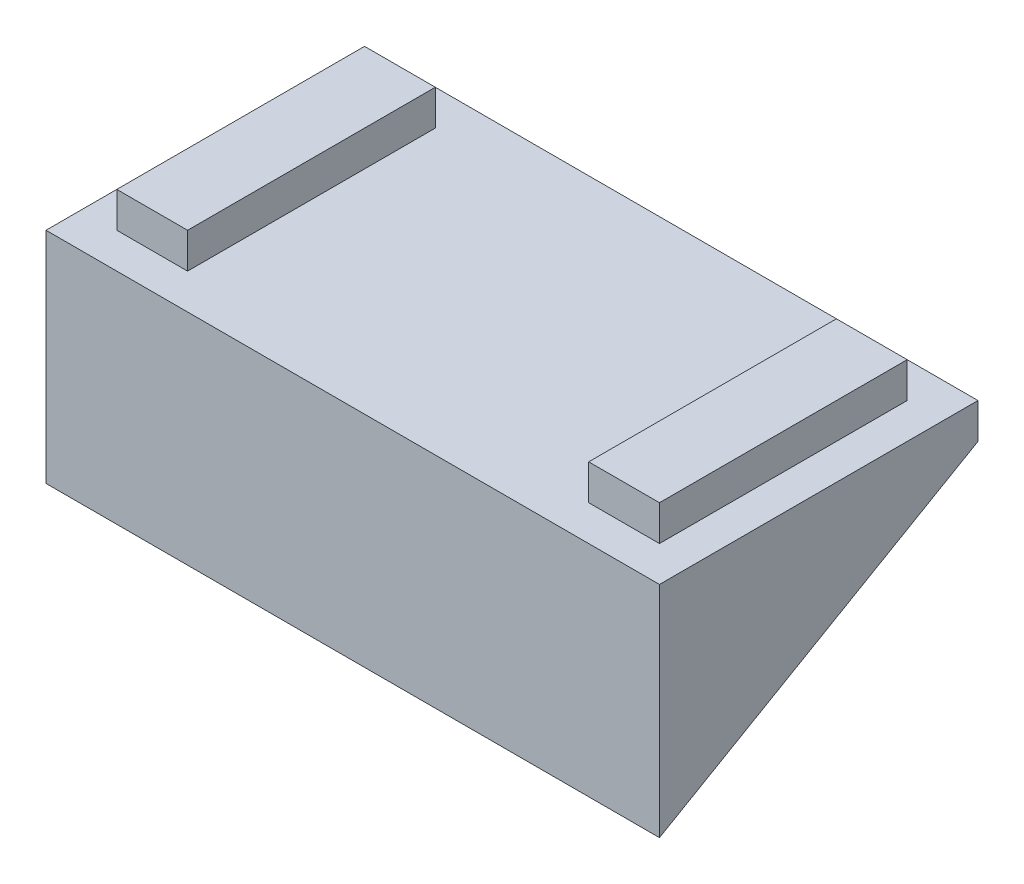
ISO-10303-21;
HEADER;
FILE_DESCRIPTION(('STEP AP214'),'2;1');
FILE_NAME('part.step','',(''),(''),'','','');
FILE_SCHEMA(('AUTOMOTIVE_DESIGN { 1 0 10303 214 1 1 1 1 }'));
ENDSEC;
DATA;
#1=APPLICATION_CONTEXT('core data for automotive mechanical design processes');
#2=APPLICATION_PROTOCOL_DEFINITION('international standard','automotive_design',2000,#1);
#3=PRODUCT_CONTEXT('',#1,'mechanical');
#4=PRODUCT('Part','Part','',(#3));
#5=PRODUCT_RELATED_PRODUCT_CATEGORY('part','',(#4));
#6=PRODUCT_DEFINITION_FORMATION('','',#4);
#7=PRODUCT_DEFINITION_CONTEXT('part definition',#1,'design');
#8=PRODUCT_DEFINITION('design','',#6,#7);
#9=PRODUCT_DEFINITION_SHAPE('','',#8);
#10=(LENGTH_UNIT() NAMED_UNIT(*) SI_UNIT(.MILLI.,.METRE.));
#11=(NAMED_UNIT(*) PLANE_ANGLE_UNIT() SI_UNIT($,.RADIAN.));
#12=(NAMED_UNIT(*) SI_UNIT($,.STERADIAN.) SOLID_ANGLE_UNIT());
#13=UNCERTAINTY_MEASURE_WITH_UNIT(LENGTH_MEASURE(1.E-05),#10,'distance_accuracy_value','');
#14=(GEOMETRIC_REPRESENTATION_CONTEXT(3) GLOBAL_UNCERTAINTY_ASSIGNED_CONTEXT((#13)) GLOBAL_UNIT_ASSIGNED_CONTEXT((#10,
#11,#12)) REPRESENTATION_CONTEXT('',''));
#15=CARTESIAN_POINT('',(0.,0.,0.));
#16=DIRECTION('',(0.,0.,1.));
#17=DIRECTION('',(1.,0.,0.));
#18=AXIS2_PLACEMENT_3D('',#15,#16,#17);
#19=CARTESIAN_POINT('',(-17.,3.,0.));
#20=DIRECTION('',(1.,0.,0.));
#21=DIRECTION('',(0.,0.,-1.));
#22=AXIS2_PLACEMENT_3D('',#19,#20,#21);
#23=PLANE('',#22);
#24=DIRECTION('',(0.,0.,1.));
#25=VECTOR('',#24,1.);
#26=CARTESIAN_POINT('',(-17.,0.,0.));
#27=LINE('',#26,#25);
#28=CARTESIAN_POINT('',(-17.,0.,-10.5));
#29=VERTEX_POINT('',#28);
#30=CARTESIAN_POINT('',(-17.,0.,10.5));
#31=VERTEX_POINT('',#30);
#32=EDGE_CURVE('E70',#29,#31,#27,.T.);
#33=ORIENTED_EDGE('',*,*,#32,.F.);
#34=DIRECTION('',(0.,-1.,0.));
#35=VECTOR('',#34,1.);
#36=CARTESIAN_POINT('',(-17.,3.,-10.5));
#37=LINE('',#36,#35);
#38=CARTESIAN_POINT('',(-17.,3.,-10.5));
#39=VERTEX_POINT('',#38);
#40=EDGE_CURVE('E11',#39,#29,#37,.T.);
#41=ORIENTED_EDGE('',*,*,#40,.F.);
#42=DIRECTION('',(0.,0.,1.));
#43=VECTOR('',#42,1.);
#44=CARTESIAN_POINT('',(-17.,3.,0.));
#45=LINE('',#44,#43);
#46=CARTESIAN_POINT('',(-17.,3.,10.5));
#47=VERTEX_POINT('',#46);
#48=EDGE_CURVE('E96',#39,#47,#45,.T.);
#49=ORIENTED_EDGE('',*,*,#48,.T.);
#50=DIRECTION('',(0.,-1.,0.));
#51=VECTOR('',#50,1.);
#52=CARTESIAN_POINT('',(-17.,3.,10.5));
#53=LINE('',#52,#51);
#54=EDGE_CURVE('E101',#47,#31,#53,.T.);
#55=ORIENTED_EDGE('',*,*,#54,.T.);
#56=EDGE_LOOP('',(#33,#41,#49,#55));
#57=FACE_BOUND('',#56,.T.);
#58=ADVANCED_FACE('F33',(#57),#23,.T.);
#59=CARTESIAN_POINT('',(0.,3.,-10.5));
#60=DIRECTION('',(0.,0.,-1.));
#61=DIRECTION('',(-1.,0.,0.));
#62=AXIS2_PLACEMENT_3D('',#59,#60,#61);
#63=PLANE('',#62);
#64=DIRECTION('',(1.,0.,0.));
#65=VECTOR('',#64,1.);
#66=CARTESIAN_POINT('',(0.,0.,-10.5));
#67=LINE('',#66,#65);
#68=CARTESIAN_POINT('',(-23.,0.,-10.5));
#69=VERTEX_POINT('',#68);
#70=EDGE_CURVE('E78',#69,#29,#67,.T.);
#71=ORIENTED_EDGE('',*,*,#70,.F.);
#72=DIRECTION('',(0.,-1.,0.));
#73=VECTOR('',#72,1.);
#74=CARTESIAN_POINT('',(-23.,3.,-10.5));
#75=LINE('',#74,#73);
#76=CARTESIAN_POINT('',(-23.,3.,-10.5));
#77=VERTEX_POINT('',#76);
#78=EDGE_CURVE('E40',#77,#69,#75,.T.);
#79=ORIENTED_EDGE('',*,*,#78,.F.);
#80=DIRECTION('',(1.,0.,0.));
#81=VECTOR('',#80,1.);
#82=CARTESIAN_POINT('',(0.,3.,-10.5));
#83=LINE('',#82,#81);
#84=EDGE_CURVE('E88',#77,#39,#83,.T.);
#85=ORIENTED_EDGE('',*,*,#84,.T.);
#86=ORIENTED_EDGE('',*,*,#40,.T.);
#87=EDGE_LOOP('',(#71,#79,#85,#86));
#88=FACE_BOUND('',#87,.T.);
#89=ADVANCED_FACE('F87',(#88),#63,.T.);
#90=CARTESIAN_POINT('',(-23.,3.,0.));
#91=DIRECTION('',(-1.,0.,0.));
#92=DIRECTION('',(0.,0.,1.));
#93=AXIS2_PLACEMENT_3D('',#90,#91,#92);
#94=PLANE('',#93);
#95=DIRECTION('',(0.,0.,-1.));
#96=VECTOR('',#95,1.);
#97=CARTESIAN_POINT('',(-23.,0.,0.));
#98=LINE('',#97,#96);
#99=CARTESIAN_POINT('',(-23.,0.,10.5));
#100=VERTEX_POINT('',#99);
#101=EDGE_CURVE('E108',#100,#69,#98,.T.);
#102=ORIENTED_EDGE('',*,*,#101,.F.);
#103=DIRECTION('',(0.,-1.,0.));
#104=VECTOR('',#103,1.);
#105=CARTESIAN_POINT('',(-23.,3.,10.5));
#106=LINE('',#105,#104);
#107=CARTESIAN_POINT('',(-23.,3.,10.5));
#108=VERTEX_POINT('',#107);
#109=EDGE_CURVE('E92',#108,#100,#106,.T.);
#110=ORIENTED_EDGE('',*,*,#109,.F.);
#111=DIRECTION('',(0.,0.,-1.));
#112=VECTOR('',#111,1.);
#113=CARTESIAN_POINT('',(-23.,3.,0.));
#114=LINE('',#113,#112);
#115=EDGE_CURVE('E94',#108,#77,#114,.T.);
#116=ORIENTED_EDGE('',*,*,#115,.T.);
#117=ORIENTED_EDGE('',*,*,#78,.T.);
#118=EDGE_LOOP('',(#102,#110,#116,#117));
#119=FACE_BOUND('',#118,.T.);
#120=ADVANCED_FACE('F98',(#119),#94,.T.);
#121=CARTESIAN_POINT('',(0.,3.,10.5));
#122=DIRECTION('',(0.,0.,-1.));
#123=DIRECTION('',(-1.,0.,0.));
#124=AXIS2_PLACEMENT_3D('',#121,#122,#123);
#125=PLANE('',#124);
#126=DIRECTION('',(1.,0.,0.));
#127=VECTOR('',#126,1.);
#128=CARTESIAN_POINT('',(0.,0.,10.5));
#129=LINE('',#128,#127);
#130=EDGE_CURVE('E110',#100,#31,#129,.T.);
#131=ORIENTED_EDGE('',*,*,#130,.T.);
#132=ORIENTED_EDGE('',*,*,#54,.F.);
#133=DIRECTION('',(1.,0.,0.));
#134=VECTOR('',#133,1.);
#135=CARTESIAN_POINT('',(0.,3.,10.5));
#136=LINE('',#135,#134);
#137=EDGE_CURVE('E56',#108,#47,#136,.T.);
#138=ORIENTED_EDGE('',*,*,#137,.F.);
#139=ORIENTED_EDGE('',*,*,#109,.T.);
#140=EDGE_LOOP('',(#131,#132,#138,#139));
#141=FACE_BOUND('',#140,.T.);
#142=ADVANCED_FACE('F115',(#141),#125,.F.);
#143=CARTESIAN_POINT('',(0.,3.,0.));
#144=DIRECTION('',(0.,1.,0.));
#145=DIRECTION('',(0.,0.,1.));
#146=AXIS2_PLACEMENT_3D('',#143,#144,#145);
#147=PLANE('',#146);
#148=ORIENTED_EDGE('',*,*,#48,.F.);
#149=ORIENTED_EDGE('',*,*,#84,.F.);
#150=ORIENTED_EDGE('',*,*,#115,.F.);
#151=ORIENTED_EDGE('',*,*,#137,.T.);
#152=EDGE_LOOP('',(#148,#149,#150,#151));
#153=FACE_BOUND('',#152,.T.);
#154=ADVANCED_FACE('F93',(#153),#147,.T.);
#155=CARTESIAN_POINT('',(26.,-3.,13.5));
#156=DIRECTION('',(0.,0.,1.));
#157=DIRECTION('',(1.,0.,0.));
#158=AXIS2_PLACEMENT_3D('',#155,#156,#157);
#159=PLANE('',#158);
#160=DIRECTION('',(-1.,0.,0.));
#161=VECTOR('',#160,1.);
#162=CARTESIAN_POINT('',(26.,0.,13.5));
#163=LINE('',#162,#161);
#164=CARTESIAN_POINT('',(26.,0.,13.5));
#165=VERTEX_POINT('',#164);
#166=CARTESIAN_POINT('',(-26.,0.,13.5));
#167=VERTEX_POINT('',#166);
#168=EDGE_CURVE('E133',#165,#167,#163,.T.);
#169=ORIENTED_EDGE('',*,*,#168,.T.);
#170=DIRECTION('',(0.,1.,0.));
#171=VECTOR('',#170,1.);
#172=CARTESIAN_POINT('',(-26.,-3.,13.5));
#173=LINE('',#172,#171);
#174=CARTESIAN_POINT('',(-26.,-18.5884572681197,13.5));
#175=VERTEX_POINT('',#174);
#176=EDGE_CURVE('E158',#175,#167,#173,.T.);
#177=ORIENTED_EDGE('',*,*,#176,.F.);
#178=DIRECTION('',(-1.,0.,0.));
#179=VECTOR('',#178,1.);
#180=CARTESIAN_POINT('',(26.,-18.5884572681197,13.5));
#181=LINE('',#180,#179);
#182=CARTESIAN_POINT('',(26.,-18.5884572681197,13.5));
#183=VERTEX_POINT('',#182);
#184=EDGE_CURVE('E106',#183,#175,#181,.T.);
#185=ORIENTED_EDGE('',*,*,#184,.F.);
#186=DIRECTION('',(0.,1.,0.));
#187=VECTOR('',#186,1.);
#188=CARTESIAN_POINT('',(26.,-3.,13.5));
#189=LINE('',#188,#187);
#190=EDGE_CURVE('E160',#183,#165,#189,.T.);
#191=ORIENTED_EDGE('',*,*,#190,.T.);
#192=EDGE_LOOP('',(#169,#177,#185,#191));
#193=FACE_BOUND('',#192,.T.);
#194=ADVANCED_FACE('F180',(#193),#159,.T.);
#195=CARTESIAN_POINT('',(26.,-18.5884572681197,13.5));
#196=DIRECTION('',(0.,-0.866025403784442,-0.499999999999995));
#197=DIRECTION('',(0.,0.499999999999995,-0.866025403784442));
#198=AXIS2_PLACEMENT_3D('',#195,#196,#197);
#199=PLANE('',#198);
#200=DIRECTION('',(0.,-0.499999999999995,0.866025403784442));
#201=VECTOR('',#200,1.);
#202=CARTESIAN_POINT('',(-26.,-18.5884572681197,13.5));
#203=LINE('',#202,#201);
#204=CARTESIAN_POINT('',(-26.,-3.,-13.5));
#205=VERTEX_POINT('',#204);
#206=EDGE_CURVE('E147',#205,#175,#203,.T.);
#207=ORIENTED_EDGE('',*,*,#206,.F.);
#208=DIRECTION('',(-1.,0.,0.));
#209=VECTOR('',#208,1.);
#210=CARTESIAN_POINT('',(26.,-3.,-13.5));
#211=LINE('',#210,#209);
#212=CARTESIAN_POINT('',(26.,-3.,-13.5));
#213=VERTEX_POINT('',#212);
#214=EDGE_CURVE('E163',#213,#205,#211,.T.);
#215=ORIENTED_EDGE('',*,*,#214,.F.);
#216=DIRECTION('',(0.,-0.499999999999995,0.866025403784442));
#217=VECTOR('',#216,1.);
#218=CARTESIAN_POINT('',(26.,-18.5884572681197,13.5));
#219=LINE('',#218,#217);
#220=EDGE_CURVE('E153',#213,#183,#219,.T.);
#221=ORIENTED_EDGE('',*,*,#220,.T.);
#222=ORIENTED_EDGE('',*,*,#184,.T.);
#223=EDGE_LOOP('',(#207,#215,#221,#222));
#224=FACE_BOUND('',#223,.T.);
#225=ADVANCED_FACE('F184',(#224),#199,.T.);
#226=CARTESIAN_POINT('',(26.,0.,-13.5));
#227=DIRECTION('',(0.,0.,-1.));
#228=DIRECTION('',(-1.,0.,0.));
#229=AXIS2_PLACEMENT_3D('',#226,#227,#228);
#230=PLANE('',#229);
#231=DIRECTION('',(0.,-1.,0.));
#232=VECTOR('',#231,1.);
#233=CARTESIAN_POINT('',(-26.,0.,-13.5));
#234=LINE('',#233,#232);
#235=CARTESIAN_POINT('',(-26.,0.,-13.5));
#236=VERTEX_POINT('',#235);
#237=EDGE_CURVE('E144',#236,#205,#234,.T.);
#238=ORIENTED_EDGE('',*,*,#237,.F.);
#239=DIRECTION('',(-1.,0.,0.));
#240=VECTOR('',#239,1.);
#241=CARTESIAN_POINT('',(26.,0.,-13.5));
#242=LINE('',#241,#240);
#243=CARTESIAN_POINT('',(26.,0.,-13.5));
#244=VERTEX_POINT('',#243);
#245=EDGE_CURVE('E137',#244,#236,#242,.T.);
#246=ORIENTED_EDGE('',*,*,#245,.F.);
#247=DIRECTION('',(0.,-1.,0.));
#248=VECTOR('',#247,1.);
#249=CARTESIAN_POINT('',(26.,0.,-13.5));
#250=LINE('',#249,#248);
#251=EDGE_CURVE('E259',#244,#213,#250,.T.);
#252=ORIENTED_EDGE('',*,*,#251,.T.);
#253=ORIENTED_EDGE('',*,*,#214,.T.);
#254=EDGE_LOOP('',(#238,#246,#252,#253));
#255=FACE_BOUND('',#254,.T.);
#256=ADVANCED_FACE('F121',(#255),#230,.T.);
#257=CARTESIAN_POINT('',(26.,0.,13.5));
#258=DIRECTION('',(0.,1.,0.));
#259=DIRECTION('',(0.,0.,1.));
#260=AXIS2_PLACEMENT_3D('',#257,#258,#259);
#261=PLANE('',#260);
#262=DIRECTION('',(1.,0.,0.));
#263=VECTOR('',#262,1.);
#264=CARTESIAN_POINT('',(0.,0.,-10.5));
#265=LINE('',#264,#263);
#266=CARTESIAN_POINT('',(17.,0.,-10.5));
#267=VERTEX_POINT('',#266);
#268=CARTESIAN_POINT('',(23.,0.,-10.5));
#269=VERTEX_POINT('',#268);
#270=EDGE_CURVE('E245',#267,#269,#265,.T.);
#271=ORIENTED_EDGE('',*,*,#270,.T.);
#272=DIRECTION('',(0.,0.,-1.));
#273=VECTOR('',#272,1.);
#274=CARTESIAN_POINT('',(23.,0.,0.));
#275=LINE('',#274,#273);
#276=CARTESIAN_POINT('',(23.,0.,10.5));
#277=VERTEX_POINT('',#276);
#278=EDGE_CURVE('E235',#277,#269,#275,.T.);
#279=ORIENTED_EDGE('',*,*,#278,.F.);
#280=DIRECTION('',(1.,0.,0.));
#281=VECTOR('',#280,1.);
#282=CARTESIAN_POINT('',(0.,0.,10.5));
#283=LINE('',#282,#281);
#284=CARTESIAN_POINT('',(17.,0.,10.5));
#285=VERTEX_POINT('',#284);
#286=EDGE_CURVE('E239',#285,#277,#283,.T.);
#287=ORIENTED_EDGE('',*,*,#286,.F.);
#288=DIRECTION('',(0.,0.,1.));
#289=VECTOR('',#288,1.);
#290=CARTESIAN_POINT('',(17.,0.,0.));
#291=LINE('',#290,#289);
#292=EDGE_CURVE('E248',#267,#285,#291,.T.);
#293=ORIENTED_EDGE('',*,*,#292,.F.);
#294=EDGE_LOOP('',(#271,#279,#287,#293));
#295=FACE_BOUND('',#294,.T.);
#296=ORIENTED_EDGE('',*,*,#70,.T.);
#297=ORIENTED_EDGE('',*,*,#32,.T.);
#298=ORIENTED_EDGE('',*,*,#130,.F.);
#299=ORIENTED_EDGE('',*,*,#101,.T.);
#300=EDGE_LOOP('',(#296,#297,#298,#299));
#301=FACE_BOUND('',#300,.T.);
#302=DIRECTION('',(0.,0.,-1.));
#303=VECTOR('',#302,1.);
#304=CARTESIAN_POINT('',(-26.,0.,13.5));
#305=LINE('',#304,#303);
#306=EDGE_CURVE('E129',#167,#236,#305,.T.);
#307=ORIENTED_EDGE('',*,*,#306,.F.);
#308=ORIENTED_EDGE('',*,*,#168,.F.);
#309=DIRECTION('',(0.,0.,-1.));
#310=VECTOR('',#309,1.);
#311=CARTESIAN_POINT('',(26.,0.,13.5));
#312=LINE('',#311,#310);
#313=EDGE_CURVE('E258',#165,#244,#312,.T.);
#314=ORIENTED_EDGE('',*,*,#313,.T.);
#315=ORIENTED_EDGE('',*,*,#245,.T.);
#316=EDGE_LOOP('',(#307,#308,#314,#315));
#317=FACE_BOUND('',#316,.T.);
#318=ADVANCED_FACE('F117',(#295,#301,#317),#261,.T.);
#319=CARTESIAN_POINT('',(26.,0.,0.));
#320=DIRECTION('',(-1.,0.,0.));
#321=DIRECTION('',(0.,0.,1.));
#322=AXIS2_PLACEMENT_3D('',#319,#320,#321);
#323=PLANE('',#322);
#324=ORIENTED_EDGE('',*,*,#313,.F.);
#325=ORIENTED_EDGE('',*,*,#190,.F.);
#326=ORIENTED_EDGE('',*,*,#220,.F.);
#327=ORIENTED_EDGE('',*,*,#251,.F.);
#328=EDGE_LOOP('',(#324,#325,#326,#327));
#329=FACE_BOUND('',#328,.T.);
#330=ADVANCED_FACE('F120',(#329),#323,.F.);
#331=CARTESIAN_POINT('',(-26.,0.,0.));
#332=DIRECTION('',(-1.,0.,0.));
#333=DIRECTION('',(0.,0.,1.));
#334=AXIS2_PLACEMENT_3D('',#331,#332,#333);
#335=PLANE('',#334);
#336=ORIENTED_EDGE('',*,*,#237,.T.);
#337=ORIENTED_EDGE('',*,*,#206,.T.);
#338=ORIENTED_EDGE('',*,*,#176,.T.);
#339=ORIENTED_EDGE('',*,*,#306,.T.);
#340=EDGE_LOOP('',(#336,#337,#338,#339));
#341=FACE_BOUND('',#340,.T.);
#342=ADVANCED_FACE('F192',(#341),#335,.T.);
#343=CARTESIAN_POINT('',(0.,3.,-10.5));
#344=DIRECTION('',(0.,0.,-1.));
#345=DIRECTION('',(-1.,0.,0.));
#346=AXIS2_PLACEMENT_3D('',#343,#344,#345);
#347=PLANE('',#346);
#348=ORIENTED_EDGE('',*,*,#270,.F.);
#349=DIRECTION('',(0.,-1.,0.));
#350=VECTOR('',#349,1.);
#351=CARTESIAN_POINT('',(17.,3.,-10.5));
#352=LINE('',#351,#350);
#353=CARTESIAN_POINT('',(17.,3.,-10.5));
#354=VERTEX_POINT('',#353);
#355=EDGE_CURVE('E145',#354,#267,#352,.T.);
#356=ORIENTED_EDGE('',*,*,#355,.F.);
#357=DIRECTION('',(1.,0.,0.));
#358=VECTOR('',#357,1.);
#359=CARTESIAN_POINT('',(0.,3.,-10.5));
#360=LINE('',#359,#358);
#361=CARTESIAN_POINT('',(23.,3.,-10.5));
#362=VERTEX_POINT('',#361);
#363=EDGE_CURVE('E223',#354,#362,#360,.T.);
#364=ORIENTED_EDGE('',*,*,#363,.T.);
#365=DIRECTION('',(0.,-1.,0.));
#366=VECTOR('',#365,1.);
#367=CARTESIAN_POINT('',(23.,3.,-10.5));
#368=LINE('',#367,#366);
#369=EDGE_CURVE('E244',#362,#269,#368,.T.);
#370=ORIENTED_EDGE('',*,*,#369,.T.);
#371=EDGE_LOOP('',(#348,#356,#364,#370));
#372=FACE_BOUND('',#371,.T.);
#373=ADVANCED_FACE('F195',(#372),#347,.T.);
#374=CARTESIAN_POINT('',(17.,3.,0.));
#375=DIRECTION('',(1.,0.,0.));
#376=DIRECTION('',(0.,0.,-1.));
#377=AXIS2_PLACEMENT_3D('',#374,#375,#376);
#378=PLANE('',#377);
#379=ORIENTED_EDGE('',*,*,#292,.T.);
#380=DIRECTION('',(0.,-1.,0.));
#381=VECTOR('',#380,1.);
#382=CARTESIAN_POINT('',(17.,3.,10.5));
#383=LINE('',#382,#381);
#384=CARTESIAN_POINT('',(17.,3.,10.5));
#385=VERTEX_POINT('',#384);
#386=EDGE_CURVE('E150',#385,#285,#383,.T.);
#387=ORIENTED_EDGE('',*,*,#386,.F.);
#388=DIRECTION('',(0.,0.,1.));
#389=VECTOR('',#388,1.);
#390=CARTESIAN_POINT('',(17.,3.,0.));
#391=LINE('',#390,#389);
#392=EDGE_CURVE('E227',#354,#385,#391,.T.);
#393=ORIENTED_EDGE('',*,*,#392,.F.);
#394=ORIENTED_EDGE('',*,*,#355,.T.);
#395=EDGE_LOOP('',(#379,#387,#393,#394));
#396=FACE_BOUND('',#395,.T.);
#397=ADVANCED_FACE('F201',(#396),#378,.F.);
#398=CARTESIAN_POINT('',(0.,3.,10.5));
#399=DIRECTION('',(0.,0.,-1.));
#400=DIRECTION('',(-1.,0.,0.));
#401=AXIS2_PLACEMENT_3D('',#398,#399,#400);
#402=PLANE('',#401);
#403=ORIENTED_EDGE('',*,*,#286,.T.);
#404=DIRECTION('',(0.,-1.,0.));
#405=VECTOR('',#404,1.);
#406=CARTESIAN_POINT('',(23.,3.,10.5));
#407=LINE('',#406,#405);
#408=CARTESIAN_POINT('',(23.,3.,10.5));
#409=VERTEX_POINT('',#408);
#410=EDGE_CURVE('E47',#409,#277,#407,.T.);
#411=ORIENTED_EDGE('',*,*,#410,.F.);
#412=DIRECTION('',(1.,0.,0.));
#413=VECTOR('',#412,1.);
#414=CARTESIAN_POINT('',(0.,3.,10.5));
#415=LINE('',#414,#413);
#416=EDGE_CURVE('E237',#385,#409,#415,.T.);
#417=ORIENTED_EDGE('',*,*,#416,.F.);
#418=ORIENTED_EDGE('',*,*,#386,.T.);
#419=EDGE_LOOP('',(#403,#411,#417,#418));
#420=FACE_BOUND('',#419,.T.);
#421=ADVANCED_FACE('F205',(#420),#402,.F.);
#422=CARTESIAN_POINT('',(23.,3.,0.));
#423=DIRECTION('',(-1.,0.,0.));
#424=DIRECTION('',(0.,0.,1.));
#425=AXIS2_PLACEMENT_3D('',#422,#423,#424);
#426=PLANE('',#425);
#427=ORIENTED_EDGE('',*,*,#278,.T.);
#428=ORIENTED_EDGE('',*,*,#369,.F.);
#429=DIRECTION('',(0.,0.,-1.));
#430=VECTOR('',#429,1.);
#431=CARTESIAN_POINT('',(23.,3.,0.));
#432=LINE('',#431,#430);
#433=EDGE_CURVE('E229',#409,#362,#432,.T.);
#434=ORIENTED_EDGE('',*,*,#433,.F.);
#435=ORIENTED_EDGE('',*,*,#410,.T.);
#436=EDGE_LOOP('',(#427,#428,#434,#435));
#437=FACE_BOUND('',#436,.T.);
#438=ADVANCED_FACE('F209',(#437),#426,.F.);
#439=CARTESIAN_POINT('',(0.,3.,0.));
#440=DIRECTION('',(0.,1.,0.));
#441=DIRECTION('',(0.,0.,1.));
#442=AXIS2_PLACEMENT_3D('',#439,#440,#441);
#443=PLANE('',#442);
#444=ORIENTED_EDGE('',*,*,#363,.F.);
#445=ORIENTED_EDGE('',*,*,#392,.T.);
#446=ORIENTED_EDGE('',*,*,#416,.T.);
#447=ORIENTED_EDGE('',*,*,#433,.T.);
#448=EDGE_LOOP('',(#444,#445,#446,#447));
#449=FACE_BOUND('',#448,.T.);
#450=ADVANCED_FACE('F213',(#449),#443,.T.);
#451=CLOSED_SHELL('',(#58,#89,#120,#142,#154,#194,#225,#256,#318,#330,#342,#373,#397,#421,#438,#450));
#452=MANIFOLD_SOLID_BREP('B2',#451);
#453=ADVANCED_BREP_SHAPE_REPRESENTATION('',(#18,#452),#14);
#454=SHAPE_DEFINITION_REPRESENTATION(#9,#453);
ENDSEC;
END-ISO-10303-21;
